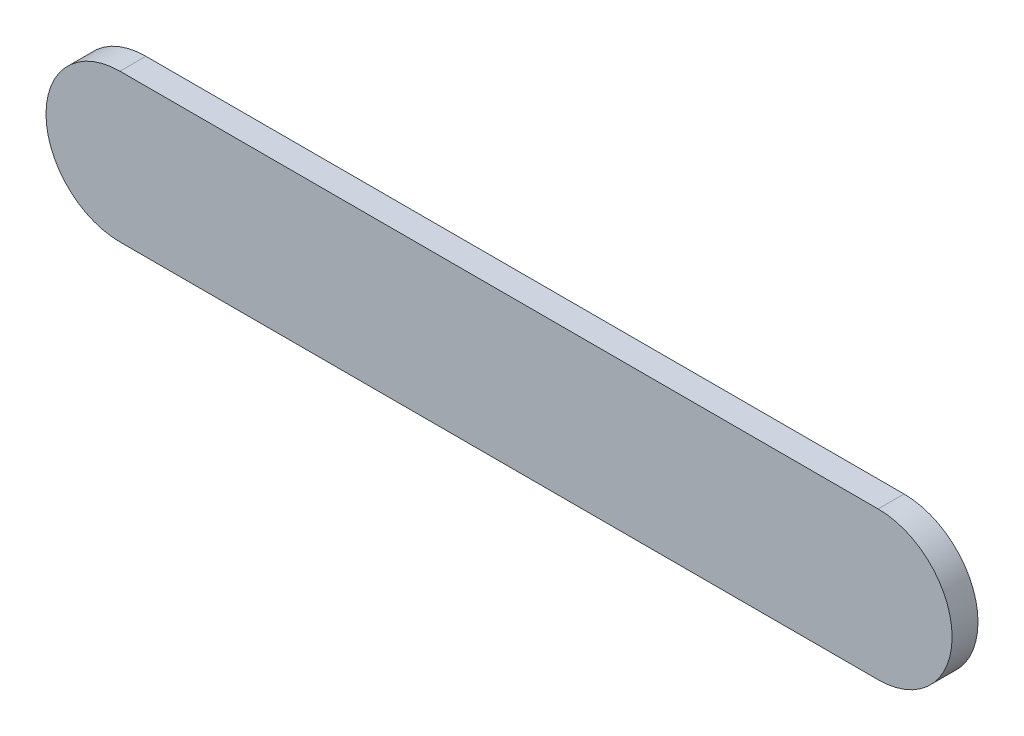
ISO-10303-21;
HEADER;
FILE_DESCRIPTION(('STEP AP214'),'2;1');
FILE_NAME('part.step','',(''),(''),'','','');
FILE_SCHEMA(('AUTOMOTIVE_DESIGN { 1 0 10303 214 1 1 1 1 }'));
ENDSEC;
DATA;
#1=APPLICATION_CONTEXT('core data for automotive mechanical design processes');
#2=APPLICATION_PROTOCOL_DEFINITION('international standard','automotive_design',2000,#1);
#3=PRODUCT_CONTEXT('',#1,'mechanical');
#4=PRODUCT('Part','Part','',(#3));
#5=PRODUCT_RELATED_PRODUCT_CATEGORY('part','',(#4));
#6=PRODUCT_DEFINITION_FORMATION('','',#4);
#7=PRODUCT_DEFINITION_CONTEXT('part definition',#1,'design');
#8=PRODUCT_DEFINITION('design','',#6,#7);
#9=PRODUCT_DEFINITION_SHAPE('','',#8);
#10=(LENGTH_UNIT() NAMED_UNIT(*) SI_UNIT(.MILLI.,.METRE.));
#11=(NAMED_UNIT(*) PLANE_ANGLE_UNIT() SI_UNIT($,.RADIAN.));
#12=(NAMED_UNIT(*) SI_UNIT($,.STERADIAN.) SOLID_ANGLE_UNIT());
#13=UNCERTAINTY_MEASURE_WITH_UNIT(LENGTH_MEASURE(1.E-05),#10,'distance_accuracy_value','');
#14=(GEOMETRIC_REPRESENTATION_CONTEXT(3) GLOBAL_UNCERTAINTY_ASSIGNED_CONTEXT((#13)) GLOBAL_UNIT_ASSIGNED_CONTEXT((#10,
#11,#12)) REPRESENTATION_CONTEXT('',''));
#15=CARTESIAN_POINT('',(0.,0.,0.));
#16=DIRECTION('',(0.,0.,1.));
#17=DIRECTION('',(1.,0.,0.));
#18=AXIS2_PLACEMENT_3D('',#15,#16,#17);
#19=CARTESIAN_POINT('',(86.175,-134.215,1.635));
#20=DIRECTION('',(0.,0.,1.));
#21=DIRECTION('',(1.,0.,0.));
#22=AXIS2_PLACEMENT_3D('',#19,#20,#21);
#23=PLANE('',#22);
#24=DIRECTION('',(1.,0.,0.));
#25=VECTOR('',#24,1.);
#26=CARTESIAN_POINT('',(86.175,-134.215,1.635));
#27=LINE('',#26,#25);
#28=CARTESIAN_POINT('',(86.175,-134.215,1.635));
#29=VERTEX_POINT('',#28);
#30=CARTESIAN_POINT('',(87.2,-134.215,1.635));
#31=VERTEX_POINT('',#30);
#32=EDGE_CURVE('E80',#29,#31,#27,.T.);
#33=ORIENTED_EDGE('',*,*,#32,.T.);
#34=CARTESIAN_POINT('',(87.2,-134.115,1.635));
#35=DIRECTION('',(0.,0.,1.));
#36=DIRECTION('',(1.42108547152E-13,-1.,0.));
#37=AXIS2_PLACEMENT_3D('',#34,#35,#36);
#38=CIRCLE('',#37,0.1);
#39=CARTESIAN_POINT('',(87.2,-134.015,1.635));
#40=VERTEX_POINT('',#39);
#41=EDGE_CURVE('E78',#31,#40,#38,.T.);
#42=ORIENTED_EDGE('',*,*,#41,.T.);
#43=DIRECTION('',(-1.,0.,0.));
#44=VECTOR('',#43,1.);
#45=CARTESIAN_POINT('',(87.2,-134.015,1.635));
#46=LINE('',#45,#44);
#47=CARTESIAN_POINT('',(86.175,-134.015,1.635));
#48=VERTEX_POINT('',#47);
#49=EDGE_CURVE('E67',#40,#48,#46,.T.);
#50=ORIENTED_EDGE('',*,*,#49,.T.);
#51=CARTESIAN_POINT('',(86.175,-134.115,1.635));
#52=DIRECTION('',(0.,0.,1.));
#53=DIRECTION('',(-1.42108547152E-13,1.,0.));
#54=AXIS2_PLACEMENT_3D('',#51,#52,#53);
#55=CIRCLE('',#54,0.1);
#56=EDGE_CURVE('E11',#48,#29,#55,.T.);
#57=ORIENTED_EDGE('',*,*,#56,.T.);
#58=EDGE_LOOP('',(#33,#42,#50,#57));
#59=FACE_BOUND('',#58,.T.);
#60=ADVANCED_FACE('F17',(#59),#23,.T.);
#61=CARTESIAN_POINT('',(86.175,-134.215,1.6));
#62=DIRECTION('',(0.,0.,1.));
#63=DIRECTION('',(1.,0.,0.));
#64=AXIS2_PLACEMENT_3D('',#61,#62,#63);
#65=PLANE('',#64);
#66=CARTESIAN_POINT('',(86.175,-134.115,1.6));
#67=DIRECTION('',(0.,0.,1.));
#68=DIRECTION('',(-1.42108547152E-13,1.,0.));
#69=AXIS2_PLACEMENT_3D('',#66,#67,#68);
#70=CIRCLE('',#69,0.1);
#71=CARTESIAN_POINT('',(86.175,-134.015,1.6));
#72=VERTEX_POINT('',#71);
#73=CARTESIAN_POINT('',(86.175,-134.215,1.6));
#74=VERTEX_POINT('',#73);
#75=EDGE_CURVE('E27',#72,#74,#70,.T.);
#76=ORIENTED_EDGE('',*,*,#75,.F.);
#77=DIRECTION('',(-1.,0.,0.));
#78=VECTOR('',#77,1.);
#79=CARTESIAN_POINT('',(87.2,-134.015,1.6));
#80=LINE('',#79,#78);
#81=CARTESIAN_POINT('',(87.2,-134.015,1.6));
#82=VERTEX_POINT('',#81);
#83=EDGE_CURVE('E60',#82,#72,#80,.T.);
#84=ORIENTED_EDGE('',*,*,#83,.F.);
#85=CARTESIAN_POINT('',(87.2,-134.115,1.6));
#86=DIRECTION('',(0.,0.,1.));
#87=DIRECTION('',(1.42108547152E-13,-1.,0.));
#88=AXIS2_PLACEMENT_3D('',#85,#86,#87);
#89=CIRCLE('',#88,0.1);
#90=CARTESIAN_POINT('',(87.2,-134.215,1.6));
#91=VERTEX_POINT('',#90);
#92=EDGE_CURVE('E87',#91,#82,#89,.T.);
#93=ORIENTED_EDGE('',*,*,#92,.F.);
#94=DIRECTION('',(1.,0.,0.));
#95=VECTOR('',#94,1.);
#96=CARTESIAN_POINT('',(86.175,-134.215,1.6));
#97=LINE('',#96,#95);
#98=EDGE_CURVE('E110',#74,#91,#97,.T.);
#99=ORIENTED_EDGE('',*,*,#98,.F.);
#100=EDGE_LOOP('',(#76,#84,#93,#99));
#101=FACE_BOUND('',#100,.T.);
#102=ADVANCED_FACE('F19',(#101),#65,.F.);
#103=CARTESIAN_POINT('',(86.175,-134.115,1.6));
#104=DIRECTION('',(0.,0.,-1.));
#105=DIRECTION('',(-1.42108547152E-13,1.,0.));
#106=AXIS2_PLACEMENT_3D('',#103,#104,#105);
#107=CYLINDRICAL_SURFACE('',#106,0.1);
#108=ORIENTED_EDGE('',*,*,#75,.T.);
#109=DIRECTION('',(0.,0.,1.));
#110=VECTOR('',#109,1.);
#111=CARTESIAN_POINT('',(86.175,-134.215,1.6));
#112=LINE('',#111,#110);
#113=EDGE_CURVE('E94',#74,#29,#112,.T.);
#114=ORIENTED_EDGE('',*,*,#113,.T.);
#115=ORIENTED_EDGE('',*,*,#56,.F.);
#116=DIRECTION('',(0.,0.,1.));
#117=VECTOR('',#116,1.);
#118=CARTESIAN_POINT('',(86.175,-134.015,1.6));
#119=LINE('',#118,#117);
#120=EDGE_CURVE('E73',#72,#48,#119,.T.);
#121=ORIENTED_EDGE('',*,*,#120,.F.);
#122=EDGE_LOOP('',(#108,#114,#115,#121));
#123=FACE_BOUND('',#122,.T.);
#124=ADVANCED_FACE('F104',(#123),#107,.T.);
#125=CARTESIAN_POINT('',(87.2,-134.015,1.6));
#126=DIRECTION('',(0.,-1.,0.));
#127=DIRECTION('',(0.,0.,-1.));
#128=AXIS2_PLACEMENT_3D('',#125,#126,#127);
#129=PLANE('',#128);
#130=ORIENTED_EDGE('',*,*,#83,.T.);
#131=ORIENTED_EDGE('',*,*,#120,.T.);
#132=ORIENTED_EDGE('',*,*,#49,.F.);
#133=DIRECTION('',(0.,0.,1.));
#134=VECTOR('',#133,1.);
#135=CARTESIAN_POINT('',(87.2,-134.015,1.6));
#136=LINE('',#135,#134);
#137=EDGE_CURVE('E71',#82,#40,#136,.T.);
#138=ORIENTED_EDGE('',*,*,#137,.F.);
#139=EDGE_LOOP('',(#130,#131,#132,#138));
#140=FACE_BOUND('',#139,.T.);
#141=ADVANCED_FACE('F69',(#140),#129,.F.);
#142=CARTESIAN_POINT('',(87.2,-134.115,1.6));
#143=DIRECTION('',(0.,0.,-1.));
#144=DIRECTION('',(1.42108547152E-13,-1.,0.));
#145=AXIS2_PLACEMENT_3D('',#142,#143,#144);
#146=CYLINDRICAL_SURFACE('',#145,0.1);
#147=ORIENTED_EDGE('',*,*,#92,.T.);
#148=ORIENTED_EDGE('',*,*,#137,.T.);
#149=ORIENTED_EDGE('',*,*,#41,.F.);
#150=DIRECTION('',(0.,0.,1.));
#151=VECTOR('',#150,1.);
#152=CARTESIAN_POINT('',(87.2,-134.215,1.6));
#153=LINE('',#152,#151);
#154=EDGE_CURVE('E114',#91,#31,#153,.T.);
#155=ORIENTED_EDGE('',*,*,#154,.F.);
#156=EDGE_LOOP('',(#147,#148,#149,#155));
#157=FACE_BOUND('',#156,.T.);
#158=ADVANCED_FACE('F86',(#157),#146,.T.);
#159=CARTESIAN_POINT('',(86.175,-134.215,1.6));
#160=DIRECTION('',(0.,1.,0.));
#161=DIRECTION('',(1.,0.,0.));
#162=AXIS2_PLACEMENT_3D('',#159,#160,#161);
#163=PLANE('',#162);
#164=ORIENTED_EDGE('',*,*,#98,.T.);
#165=ORIENTED_EDGE('',*,*,#154,.T.);
#166=ORIENTED_EDGE('',*,*,#32,.F.);
#167=ORIENTED_EDGE('',*,*,#113,.F.);
#168=EDGE_LOOP('',(#164,#165,#166,#167));
#169=FACE_BOUND('',#168,.T.);
#170=ADVANCED_FACE('F109',(#169),#163,.F.);
#171=CLOSED_SHELL('',(#60,#102,#124,#141,#158,#170));
#172=MANIFOLD_SOLID_BREP('B1',#171);
#173=ADVANCED_BREP_SHAPE_REPRESENTATION('',(#18,#172),#14);
#174=SHAPE_DEFINITION_REPRESENTATION(#9,#173);
ENDSEC;
END-ISO-10303-21;
